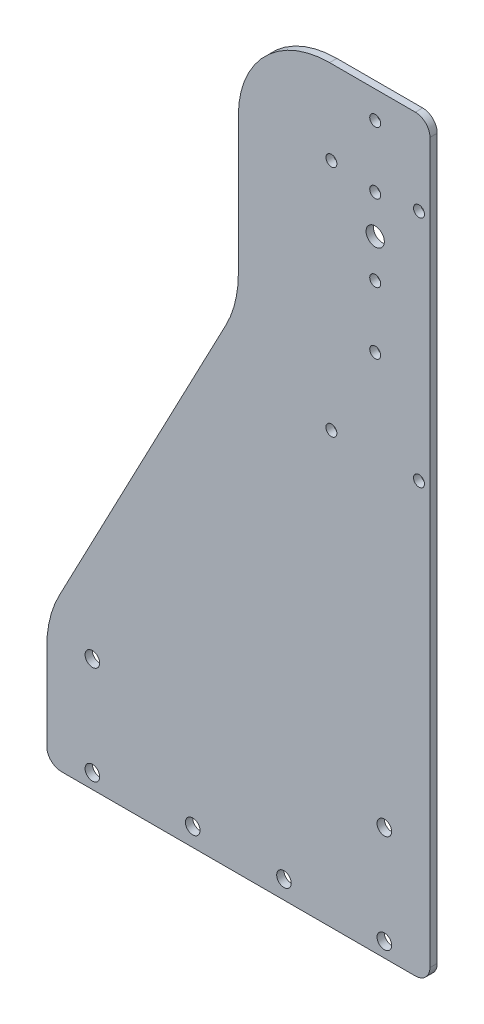
ISO-10303-21;
HEADER;
FILE_DESCRIPTION(('STEP AP214'),'2;1');
FILE_NAME('part.step','',(''),(''),'','','');
FILE_SCHEMA(('AUTOMOTIVE_DESIGN { 1 0 10303 214 1 1 1 1 }'));
ENDSEC;
DATA;
#1=APPLICATION_CONTEXT('core data for automotive mechanical design processes');
#2=APPLICATION_PROTOCOL_DEFINITION('international standard','automotive_design',2000,#1);
#3=PRODUCT_CONTEXT('',#1,'mechanical');
#4=PRODUCT('Part','Part','',(#3));
#5=PRODUCT_RELATED_PRODUCT_CATEGORY('part','',(#4));
#6=PRODUCT_DEFINITION_FORMATION('','',#4);
#7=PRODUCT_DEFINITION_CONTEXT('part definition',#1,'design');
#8=PRODUCT_DEFINITION('design','',#6,#7);
#9=PRODUCT_DEFINITION_SHAPE('','',#8);
#10=(LENGTH_UNIT() NAMED_UNIT(*) SI_UNIT(.MILLI.,.METRE.));
#11=(NAMED_UNIT(*) PLANE_ANGLE_UNIT() SI_UNIT($,.RADIAN.));
#12=(NAMED_UNIT(*) SI_UNIT($,.STERADIAN.) SOLID_ANGLE_UNIT());
#13=UNCERTAINTY_MEASURE_WITH_UNIT(LENGTH_MEASURE(1.E-05),#10,'distance_accuracy_value','');
#14=(GEOMETRIC_REPRESENTATION_CONTEXT(3) GLOBAL_UNCERTAINTY_ASSIGNED_CONTEXT((#13)) GLOBAL_UNIT_ASSIGNED_CONTEXT((#10,
#11,#12)) REPRESENTATION_CONTEXT('',''));
#15=CARTESIAN_POINT('',(0.,0.,0.));
#16=DIRECTION('',(0.,0.,1.));
#17=DIRECTION('',(1.,0.,0.));
#18=AXIS2_PLACEMENT_3D('',#15,#16,#17);
#19=CARTESIAN_POINT('',(45.,284.792651406589,4.));
#20=DIRECTION('',(0.,0.,1.));
#21=DIRECTION('',(1.,0.,0.));
#22=AXIS2_PLACEMENT_3D('',#19,#20,#21);
#23=PLANE('',#22);
#24=CARTESIAN_POINT('',(155.,360.,4.));
#25=DIRECTION('',(0.,0.,-1.));
#26=DIRECTION('',(-1.,0.,0.));
#27=AXIS2_PLACEMENT_3D('',#24,#25,#26);
#28=CIRCLE('',#27,50.);
#29=CARTESIAN_POINT('',(105.,360.,4.));
#30=VERTEX_POINT('',#29);
#31=CARTESIAN_POINT('',(155.,410.,4.));
#32=VERTEX_POINT('',#31);
#33=EDGE_CURVE('E138',#30,#32,#28,.T.);
#34=ORIENTED_EDGE('',*,*,#33,.F.);
#35=DIRECTION('',(0.,1.,0.));
#36=VECTOR('',#35,1.);
#37=CARTESIAN_POINT('',(105.,284.792651406589,4.));
#38=LINE('',#37,#36);
#39=CARTESIAN_POINT('',(105.,284.792651406589,4.));
#40=VERTEX_POINT('',#39);
#41=EDGE_CURVE('E132',#30,#40,#38,.F.);
#42=ORIENTED_EDGE('',*,*,#41,.T.);
#43=CARTESIAN_POINT('',(45.,284.792651406589,4.));
#44=DIRECTION('',(0.,0.,-1.));
#45=DIRECTION('',(-1.,0.,0.));
#46=AXIS2_PLACEMENT_3D('',#43,#44,#45);
#47=CIRCLE('',#46,60.);
#48=CARTESIAN_POINT('',(98.1238741702765,256.902617467193,4.));
#49=VERTEX_POINT('',#48);
#50=EDGE_CURVE('E118',#40,#49,#47,.T.);
#51=ORIENTED_EDGE('',*,*,#50,.T.);
#52=DIRECTION('',(0.46483389898992,0.885397902837944,0.));
#53=VECTOR('',#52,1.);
#54=CARTESIAN_POINT('',(6.87612582972349,83.0973825328067,4.));
#55=LINE('',#54,#53);
#56=CARTESIAN_POINT('',(6.87612582972343,83.0973825328066,4.));
#57=VERTEX_POINT('',#56);
#58=EDGE_CURVE('E114',#49,#57,#55,.F.);
#59=ORIENTED_EDGE('',*,*,#58,.T.);
#60=CARTESIAN_POINT('',(60.,55.2073485934112,4.));
#61=DIRECTION('',(0.,0.,-1.));
#62=DIRECTION('',(-1.,0.,0.));
#63=AXIS2_PLACEMENT_3D('',#60,#61,#62);
#64=CIRCLE('',#63,60.);
#65=CARTESIAN_POINT('',(0.,55.2073485934111,4.));
#66=VERTEX_POINT('',#65);
#67=EDGE_CURVE('E104',#66,#57,#64,.T.);
#68=ORIENTED_EDGE('',*,*,#67,.F.);
#69=DIRECTION('',(0.,1.,0.));
#70=VECTOR('',#69,1.);
#71=CARTESIAN_POINT('',(0.,8.00000000000006,4.));
#72=LINE('',#71,#70);
#73=CARTESIAN_POINT('',(0.,8.,4.));
#74=VERTEX_POINT('',#73);
#75=EDGE_CURVE('E128',#66,#74,#72,.F.);
#76=ORIENTED_EDGE('',*,*,#75,.T.);
#77=CARTESIAN_POINT('',(8.,8.,4.));
#78=DIRECTION('',(0.,0.,-1.));
#79=DIRECTION('',(-1.,0.,0.));
#80=AXIS2_PLACEMENT_3D('',#77,#78,#79);
#81=CIRCLE('',#80,8.);
#82=CARTESIAN_POINT('',(8.00000000000003,0.,4.));
#83=VERTEX_POINT('',#82);
#84=EDGE_CURVE('E150',#83,#74,#81,.T.);
#85=ORIENTED_EDGE('',*,*,#84,.F.);
#86=DIRECTION('',(1.,0.,0.));
#87=VECTOR('',#86,1.);
#88=CARTESIAN_POINT('',(8.00000000000006,0.,4.));
#89=LINE('',#88,#87);
#90=CARTESIAN_POINT('',(202.,0.,4.));
#91=VERTEX_POINT('',#90);
#92=EDGE_CURVE('E145',#83,#91,#89,.T.);
#93=ORIENTED_EDGE('',*,*,#92,.T.);
#94=CARTESIAN_POINT('',(202.,8.,4.));
#95=DIRECTION('',(0.,0.,-1.));
#96=DIRECTION('',(-1.,0.,0.));
#97=AXIS2_PLACEMENT_3D('',#94,#95,#96);
#98=CIRCLE('',#97,8.00000000000001);
#99=CARTESIAN_POINT('',(210.,8.00000000000003,4.));
#100=VERTEX_POINT('',#99);
#101=EDGE_CURVE('E148',#100,#91,#98,.T.);
#102=ORIENTED_EDGE('',*,*,#101,.F.);
#103=DIRECTION('',(0.,1.,0.));
#104=VECTOR('',#103,1.);
#105=CARTESIAN_POINT('',(210.,8.00000000000006,4.));
#106=LINE('',#105,#104);
#107=CARTESIAN_POINT('',(210.,402.,4.));
#108=VERTEX_POINT('',#107);
#109=EDGE_CURVE('E140',#100,#108,#106,.T.);
#110=ORIENTED_EDGE('',*,*,#109,.T.);
#111=CARTESIAN_POINT('',(202.,402.,4.));
#112=DIRECTION('',(0.,0.,-1.));
#113=DIRECTION('',(-1.,0.,0.));
#114=AXIS2_PLACEMENT_3D('',#111,#112,#113);
#115=CIRCLE('',#114,8.00000000000001);
#116=CARTESIAN_POINT('',(202.,410.,4.));
#117=VERTEX_POINT('',#116);
#118=EDGE_CURVE('E143',#117,#108,#115,.T.);
#119=ORIENTED_EDGE('',*,*,#118,.F.);
#120=DIRECTION('',(1.,0.,0.));
#121=VECTOR('',#120,1.);
#122=CARTESIAN_POINT('',(155.,410.,4.));
#123=LINE('',#122,#121);
#124=EDGE_CURVE('E135',#117,#32,#123,.F.);
#125=ORIENTED_EDGE('',*,*,#124,.T.);
#126=EDGE_LOOP('',(#34,#42,#51,#59,#68,#76,#85,#93,#102,#110,#119,#125));
#127=FACE_BOUND('',#126,.T.);
#128=CARTESIAN_POINT('',(24.9999999999999,62.,4.));
#129=DIRECTION('',(0.,0.,1.));
#130=DIRECTION('',(1.,0.,0.));
#131=AXIS2_PLACEMENT_3D('',#128,#129,#130);
#132=CIRCLE('',#131,4.00000000000012);
#133=CARTESIAN_POINT('',(29.,62.,4.));
#134=VERTEX_POINT('',#133);
#135=EDGE_CURVE('E122',#134,#134,#132,.F.);
#136=ORIENTED_EDGE('',*,*,#135,.T.);
#137=EDGE_LOOP('',(#136));
#138=FACE_BOUND('',#137,.T.);
#139=CARTESIAN_POINT('',(185.,62.,4.));
#140=DIRECTION('',(0.,0.,1.));
#141=DIRECTION('',(1.,0.,0.));
#142=AXIS2_PLACEMENT_3D('',#139,#140,#141);
#143=CIRCLE('',#142,4.00000000000009);
#144=CARTESIAN_POINT('',(189.,62.,4.));
#145=VERTEX_POINT('',#144);
#146=EDGE_CURVE('E227',#145,#145,#143,.F.);
#147=ORIENTED_EDGE('',*,*,#146,.T.);
#148=EDGE_LOOP('',(#147));
#149=FACE_BOUND('',#148,.T.);
#150=CARTESIAN_POINT('',(25.,8.,4.));
#151=DIRECTION('',(0.,0.,1.));
#152=DIRECTION('',(1.,0.,0.));
#153=AXIS2_PLACEMENT_3D('',#150,#151,#152);
#154=CIRCLE('',#153,4.00000000000001);
#155=CARTESIAN_POINT('',(29.,8.,4.));
#156=VERTEX_POINT('',#155);
#157=EDGE_CURVE('E230',#156,#156,#154,.F.);
#158=ORIENTED_EDGE('',*,*,#157,.T.);
#159=EDGE_LOOP('',(#158));
#160=FACE_BOUND('',#159,.T.);
#161=CARTESIAN_POINT('',(185.,8.00000000000001,4.));
#162=DIRECTION('',(0.,0.,1.));
#163=DIRECTION('',(1.,0.,0.));
#164=AXIS2_PLACEMENT_3D('',#161,#162,#163);
#165=CIRCLE('',#164,4.);
#166=CARTESIAN_POINT('',(189.,8.00000000000001,4.));
#167=VERTEX_POINT('',#166);
#168=EDGE_CURVE('E233',#167,#167,#165,.F.);
#169=ORIENTED_EDGE('',*,*,#168,.T.);
#170=EDGE_LOOP('',(#169));
#171=FACE_BOUND('',#170,.T.);
#172=CARTESIAN_POINT('',(80.,10.,4.));
#173=DIRECTION('',(0.,0.,1.));
#174=DIRECTION('',(1.,0.,0.));
#175=AXIS2_PLACEMENT_3D('',#172,#173,#174);
#176=CIRCLE('',#175,4.);
#177=CARTESIAN_POINT('',(84.,10.,4.));
#178=VERTEX_POINT('',#177);
#179=EDGE_CURVE('E236',#178,#178,#176,.F.);
#180=ORIENTED_EDGE('',*,*,#179,.T.);
#181=EDGE_LOOP('',(#180));
#182=FACE_BOUND('',#181,.T.);
#183=CARTESIAN_POINT('',(130.,10.,4.));
#184=DIRECTION('',(0.,0.,1.));
#185=DIRECTION('',(1.,0.,0.));
#186=AXIS2_PLACEMENT_3D('',#183,#184,#185);
#187=CIRCLE('',#186,4.);
#188=CARTESIAN_POINT('',(134.,10.,4.));
#189=VERTEX_POINT('',#188);
#190=EDGE_CURVE('E239',#189,#189,#187,.F.);
#191=ORIENTED_EDGE('',*,*,#190,.T.);
#192=EDGE_LOOP('',(#191));
#193=FACE_BOUND('',#192,.T.);
#194=CARTESIAN_POINT('',(180.,340.,4.));
#195=DIRECTION('',(0.,0.,1.));
#196=DIRECTION('',(1.,0.,0.));
#197=AXIS2_PLACEMENT_3D('',#194,#195,#196);
#198=CIRCLE('',#197,5.);
#199=CARTESIAN_POINT('',(185.,340.,4.));
#200=VERTEX_POINT('',#199);
#201=EDGE_CURVE('E242',#200,#200,#198,.F.);
#202=ORIENTED_EDGE('',*,*,#201,.T.);
#203=EDGE_LOOP('',(#202));
#204=FACE_BOUND('',#203,.T.);
#205=CARTESIAN_POINT('',(180.,395.,4.));
#206=DIRECTION('',(0.,0.,1.));
#207=DIRECTION('',(1.,0.,0.));
#208=AXIS2_PLACEMENT_3D('',#205,#206,#207);
#209=CIRCLE('',#208,3.);
#210=CARTESIAN_POINT('',(183.,395.,4.));
#211=VERTEX_POINT('',#210);
#212=EDGE_CURVE('E245',#211,#211,#209,.F.);
#213=ORIENTED_EDGE('',*,*,#212,.T.);
#214=EDGE_LOOP('',(#213));
#215=FACE_BOUND('',#214,.T.);
#216=CARTESIAN_POINT('',(180.,361.,4.));
#217=DIRECTION('',(0.,0.,1.));
#218=DIRECTION('',(1.,0.,0.));
#219=AXIS2_PLACEMENT_3D('',#216,#217,#218);
#220=CIRCLE('',#219,3.);
#221=CARTESIAN_POINT('',(183.,361.,4.));
#222=VERTEX_POINT('',#221);
#223=EDGE_CURVE('E248',#222,#222,#220,.F.);
#224=ORIENTED_EDGE('',*,*,#223,.T.);
#225=EDGE_LOOP('',(#224));
#226=FACE_BOUND('',#225,.T.);
#227=CARTESIAN_POINT('',(156.,364.,4.));
#228=DIRECTION('',(0.,0.,1.));
#229=DIRECTION('',(1.,0.,0.));
#230=AXIS2_PLACEMENT_3D('',#227,#228,#229);
#231=CIRCLE('',#230,3.);
#232=CARTESIAN_POINT('',(159.,364.,4.));
#233=VERTEX_POINT('',#232);
#234=EDGE_CURVE('E251',#233,#233,#231,.F.);
#235=ORIENTED_EDGE('',*,*,#234,.T.);
#236=EDGE_LOOP('',(#235));
#237=FACE_BOUND('',#236,.T.);
#238=CARTESIAN_POINT('',(180.,319.,4.));
#239=DIRECTION('',(0.,0.,1.));
#240=DIRECTION('',(1.,0.,0.));
#241=AXIS2_PLACEMENT_3D('',#238,#239,#240);
#242=CIRCLE('',#241,3.);
#243=CARTESIAN_POINT('',(183.,319.,4.));
#244=VERTEX_POINT('',#243);
#245=EDGE_CURVE('E254',#244,#244,#242,.F.);
#246=ORIENTED_EDGE('',*,*,#245,.T.);
#247=EDGE_LOOP('',(#246));
#248=FACE_BOUND('',#247,.T.);
#249=CARTESIAN_POINT('',(180.,285.,4.));
#250=DIRECTION('',(0.,0.,1.));
#251=DIRECTION('',(1.,0.,0.));
#252=AXIS2_PLACEMENT_3D('',#249,#250,#251);
#253=CIRCLE('',#252,3.);
#254=CARTESIAN_POINT('',(183.,285.,4.));
#255=VERTEX_POINT('',#254);
#256=EDGE_CURVE('E257',#255,#255,#253,.F.);
#257=ORIENTED_EDGE('',*,*,#256,.T.);
#258=EDGE_LOOP('',(#257));
#259=FACE_BOUND('',#258,.T.);
#260=CARTESIAN_POINT('',(156.,236.,4.));
#261=DIRECTION('',(0.,0.,1.));
#262=DIRECTION('',(1.,0.,0.));
#263=AXIS2_PLACEMENT_3D('',#260,#261,#262);
#264=CIRCLE('',#263,3.);
#265=CARTESIAN_POINT('',(159.,236.,4.));
#266=VERTEX_POINT('',#265);
#267=EDGE_CURVE('E260',#266,#266,#264,.F.);
#268=ORIENTED_EDGE('',*,*,#267,.T.);
#269=EDGE_LOOP('',(#268));
#270=FACE_BOUND('',#269,.T.);
#271=CARTESIAN_POINT('',(204.,236.,4.));
#272=DIRECTION('',(0.,0.,1.));
#273=DIRECTION('',(1.,0.,0.));
#274=AXIS2_PLACEMENT_3D('',#271,#272,#273);
#275=CIRCLE('',#274,3.);
#276=CARTESIAN_POINT('',(207.,236.,4.));
#277=VERTEX_POINT('',#276);
#278=EDGE_CURVE('E262',#277,#277,#275,.F.);
#279=ORIENTED_EDGE('',*,*,#278,.T.);
#280=EDGE_LOOP('',(#279));
#281=FACE_BOUND('',#280,.T.);
#282=CARTESIAN_POINT('',(204.,364.,4.));
#283=DIRECTION('',(0.,0.,1.));
#284=DIRECTION('',(1.,0.,0.));
#285=AXIS2_PLACEMENT_3D('',#282,#283,#284);
#286=CIRCLE('',#285,3.);
#287=CARTESIAN_POINT('',(207.,364.,4.));
#288=VERTEX_POINT('',#287);
#289=EDGE_CURVE('E20',#288,#288,#286,.F.);
#290=ORIENTED_EDGE('',*,*,#289,.T.);
#291=EDGE_LOOP('',(#290));
#292=FACE_BOUND('',#291,.T.);
#293=ADVANCED_FACE('F17',(#127,#138,#149,#160,#171,#182,#193,#204,#215,#226,#237,#248,#259,#270,
#281,#292),#23,.T.);
#294=CARTESIAN_POINT('',(204.,364.,0.));
#295=DIRECTION('',(0.,0.,1.));
#296=DIRECTION('',(1.,0.,0.));
#297=AXIS2_PLACEMENT_3D('',#294,#295,#296);
#298=CYLINDRICAL_SURFACE('',#297,3.);
#299=CARTESIAN_POINT('',(204.,364.,0.));
#300=DIRECTION('',(0.,0.,1.));
#301=DIRECTION('',(1.,0.,0.));
#302=AXIS2_PLACEMENT_3D('',#299,#300,#301);
#303=CIRCLE('',#302,3.);
#304=CARTESIAN_POINT('',(207.,364.,0.));
#305=VERTEX_POINT('',#304);
#306=EDGE_CURVE('E212',#305,#305,#303,.F.);
#307=ORIENTED_EDGE('',*,*,#306,.T.);
#308=EDGE_LOOP('',(#307));
#309=FACE_BOUND('',#308,.T.);
#310=ORIENTED_EDGE('',*,*,#289,.F.);
#311=EDGE_LOOP('',(#310));
#312=FACE_BOUND('',#311,.T.);
#313=ADVANCED_FACE('F270',(#309,#312),#298,.F.);
#314=CARTESIAN_POINT('',(204.,236.,0.));
#315=DIRECTION('',(0.,0.,1.));
#316=DIRECTION('',(1.,0.,0.));
#317=AXIS2_PLACEMENT_3D('',#314,#315,#316);
#318=CYLINDRICAL_SURFACE('',#317,3.);
#319=CARTESIAN_POINT('',(204.,236.,0.));
#320=DIRECTION('',(0.,0.,1.));
#321=DIRECTION('',(1.,0.,0.));
#322=AXIS2_PLACEMENT_3D('',#319,#320,#321);
#323=CIRCLE('',#322,3.);
#324=CARTESIAN_POINT('',(207.,236.,0.));
#325=VERTEX_POINT('',#324);
#326=EDGE_CURVE('E209',#325,#325,#323,.F.);
#327=ORIENTED_EDGE('',*,*,#326,.T.);
#328=EDGE_LOOP('',(#327));
#329=FACE_BOUND('',#328,.T.);
#330=ORIENTED_EDGE('',*,*,#278,.F.);
#331=EDGE_LOOP('',(#330));
#332=FACE_BOUND('',#331,.T.);
#333=ADVANCED_FACE('F272',(#329,#332),#318,.F.);
#334=CARTESIAN_POINT('',(156.,236.,0.));
#335=DIRECTION('',(0.,0.,1.));
#336=DIRECTION('',(1.,0.,0.));
#337=AXIS2_PLACEMENT_3D('',#334,#335,#336);
#338=CYLINDRICAL_SURFACE('',#337,3.);
#339=CARTESIAN_POINT('',(156.,236.,0.));
#340=DIRECTION('',(0.,0.,1.));
#341=DIRECTION('',(1.,0.,0.));
#342=AXIS2_PLACEMENT_3D('',#339,#340,#341);
#343=CIRCLE('',#342,3.);
#344=CARTESIAN_POINT('',(159.,236.,0.));
#345=VERTEX_POINT('',#344);
#346=EDGE_CURVE('E206',#345,#345,#343,.F.);
#347=ORIENTED_EDGE('',*,*,#346,.T.);
#348=EDGE_LOOP('',(#347));
#349=FACE_BOUND('',#348,.T.);
#350=ORIENTED_EDGE('',*,*,#267,.F.);
#351=EDGE_LOOP('',(#350));
#352=FACE_BOUND('',#351,.T.);
#353=ADVANCED_FACE('F279',(#349,#352),#338,.F.);
#354=CARTESIAN_POINT('',(180.,285.,0.));
#355=DIRECTION('',(0.,0.,1.));
#356=DIRECTION('',(1.,0.,0.));
#357=AXIS2_PLACEMENT_3D('',#354,#355,#356);
#358=CYLINDRICAL_SURFACE('',#357,3.);
#359=CARTESIAN_POINT('',(180.,285.,0.));
#360=DIRECTION('',(0.,0.,1.));
#361=DIRECTION('',(1.,0.,0.));
#362=AXIS2_PLACEMENT_3D('',#359,#360,#361);
#363=CIRCLE('',#362,3.);
#364=CARTESIAN_POINT('',(183.,285.,0.));
#365=VERTEX_POINT('',#364);
#366=EDGE_CURVE('E203',#365,#365,#363,.F.);
#367=ORIENTED_EDGE('',*,*,#366,.T.);
#368=EDGE_LOOP('',(#367));
#369=FACE_BOUND('',#368,.T.);
#370=ORIENTED_EDGE('',*,*,#256,.F.);
#371=EDGE_LOOP('',(#370));
#372=FACE_BOUND('',#371,.T.);
#373=ADVANCED_FACE('F377',(#369,#372),#358,.F.);
#374=CARTESIAN_POINT('',(180.,319.,0.));
#375=DIRECTION('',(0.,0.,1.));
#376=DIRECTION('',(1.,0.,0.));
#377=AXIS2_PLACEMENT_3D('',#374,#375,#376);
#378=CYLINDRICAL_SURFACE('',#377,3.);
#379=CARTESIAN_POINT('',(180.,319.,0.));
#380=DIRECTION('',(0.,0.,1.));
#381=DIRECTION('',(1.,0.,0.));
#382=AXIS2_PLACEMENT_3D('',#379,#380,#381);
#383=CIRCLE('',#382,3.);
#384=CARTESIAN_POINT('',(183.,319.,0.));
#385=VERTEX_POINT('',#384);
#386=EDGE_CURVE('E200',#385,#385,#383,.F.);
#387=ORIENTED_EDGE('',*,*,#386,.T.);
#388=EDGE_LOOP('',(#387));
#389=FACE_BOUND('',#388,.T.);
#390=ORIENTED_EDGE('',*,*,#245,.F.);
#391=EDGE_LOOP('',(#390));
#392=FACE_BOUND('',#391,.T.);
#393=ADVANCED_FACE('F373',(#389,#392),#378,.F.);
#394=CARTESIAN_POINT('',(156.,364.,0.));
#395=DIRECTION('',(0.,0.,1.));
#396=DIRECTION('',(1.,0.,0.));
#397=AXIS2_PLACEMENT_3D('',#394,#395,#396);
#398=CYLINDRICAL_SURFACE('',#397,3.);
#399=CARTESIAN_POINT('',(156.,364.,0.));
#400=DIRECTION('',(0.,0.,1.));
#401=DIRECTION('',(1.,0.,0.));
#402=AXIS2_PLACEMENT_3D('',#399,#400,#401);
#403=CIRCLE('',#402,3.);
#404=CARTESIAN_POINT('',(159.,364.,0.));
#405=VERTEX_POINT('',#404);
#406=EDGE_CURVE('E197',#405,#405,#403,.F.);
#407=ORIENTED_EDGE('',*,*,#406,.T.);
#408=EDGE_LOOP('',(#407));
#409=FACE_BOUND('',#408,.T.);
#410=ORIENTED_EDGE('',*,*,#234,.F.);
#411=EDGE_LOOP('',(#410));
#412=FACE_BOUND('',#411,.T.);
#413=ADVANCED_FACE('F369',(#409,#412),#398,.F.);
#414=CARTESIAN_POINT('',(180.,361.,0.));
#415=DIRECTION('',(0.,0.,1.));
#416=DIRECTION('',(1.,0.,0.));
#417=AXIS2_PLACEMENT_3D('',#414,#415,#416);
#418=CYLINDRICAL_SURFACE('',#417,3.);
#419=CARTESIAN_POINT('',(180.,361.,0.));
#420=DIRECTION('',(0.,0.,1.));
#421=DIRECTION('',(1.,0.,0.));
#422=AXIS2_PLACEMENT_3D('',#419,#420,#421);
#423=CIRCLE('',#422,3.);
#424=CARTESIAN_POINT('',(183.,361.,0.));
#425=VERTEX_POINT('',#424);
#426=EDGE_CURVE('E194',#425,#425,#423,.F.);
#427=ORIENTED_EDGE('',*,*,#426,.T.);
#428=EDGE_LOOP('',(#427));
#429=FACE_BOUND('',#428,.T.);
#430=ORIENTED_EDGE('',*,*,#223,.F.);
#431=EDGE_LOOP('',(#430));
#432=FACE_BOUND('',#431,.T.);
#433=ADVANCED_FACE('F365',(#429,#432),#418,.F.);
#434=CARTESIAN_POINT('',(180.,395.,0.));
#435=DIRECTION('',(0.,0.,1.));
#436=DIRECTION('',(1.,0.,0.));
#437=AXIS2_PLACEMENT_3D('',#434,#435,#436);
#438=CYLINDRICAL_SURFACE('',#437,3.);
#439=CARTESIAN_POINT('',(180.,395.,0.));
#440=DIRECTION('',(0.,0.,1.));
#441=DIRECTION('',(1.,0.,0.));
#442=AXIS2_PLACEMENT_3D('',#439,#440,#441);
#443=CIRCLE('',#442,3.);
#444=CARTESIAN_POINT('',(183.,395.,0.));
#445=VERTEX_POINT('',#444);
#446=EDGE_CURVE('E191',#445,#445,#443,.F.);
#447=ORIENTED_EDGE('',*,*,#446,.T.);
#448=EDGE_LOOP('',(#447));
#449=FACE_BOUND('',#448,.T.);
#450=ORIENTED_EDGE('',*,*,#212,.F.);
#451=EDGE_LOOP('',(#450));
#452=FACE_BOUND('',#451,.T.);
#453=ADVANCED_FACE('F361',(#449,#452),#438,.F.);
#454=CARTESIAN_POINT('',(180.,340.,0.));
#455=DIRECTION('',(0.,0.,1.));
#456=DIRECTION('',(1.,0.,0.));
#457=AXIS2_PLACEMENT_3D('',#454,#455,#456);
#458=CYLINDRICAL_SURFACE('',#457,5.);
#459=CARTESIAN_POINT('',(180.,340.,0.));
#460=DIRECTION('',(0.,0.,1.));
#461=DIRECTION('',(1.,0.,0.));
#462=AXIS2_PLACEMENT_3D('',#459,#460,#461);
#463=CIRCLE('',#462,5.);
#464=CARTESIAN_POINT('',(185.,340.,0.));
#465=VERTEX_POINT('',#464);
#466=EDGE_CURVE('E188',#465,#465,#463,.F.);
#467=ORIENTED_EDGE('',*,*,#466,.T.);
#468=EDGE_LOOP('',(#467));
#469=FACE_BOUND('',#468,.T.);
#470=ORIENTED_EDGE('',*,*,#201,.F.);
#471=EDGE_LOOP('',(#470));
#472=FACE_BOUND('',#471,.T.);
#473=ADVANCED_FACE('F357',(#469,#472),#458,.F.);
#474=CARTESIAN_POINT('',(130.,10.,0.));
#475=DIRECTION('',(0.,0.,1.));
#476=DIRECTION('',(1.,0.,0.));
#477=AXIS2_PLACEMENT_3D('',#474,#475,#476);
#478=CYLINDRICAL_SURFACE('',#477,4.);
#479=CARTESIAN_POINT('',(130.,10.,0.));
#480=DIRECTION('',(0.,0.,1.));
#481=DIRECTION('',(1.,0.,0.));
#482=AXIS2_PLACEMENT_3D('',#479,#480,#481);
#483=CIRCLE('',#482,4.);
#484=CARTESIAN_POINT('',(134.,10.,0.));
#485=VERTEX_POINT('',#484);
#486=EDGE_CURVE('E185',#485,#485,#483,.F.);
#487=ORIENTED_EDGE('',*,*,#486,.T.);
#488=EDGE_LOOP('',(#487));
#489=FACE_BOUND('',#488,.T.);
#490=ORIENTED_EDGE('',*,*,#190,.F.);
#491=EDGE_LOOP('',(#490));
#492=FACE_BOUND('',#491,.T.);
#493=ADVANCED_FACE('F353',(#489,#492),#478,.F.);
#494=CARTESIAN_POINT('',(80.,10.,0.));
#495=DIRECTION('',(0.,0.,1.));
#496=DIRECTION('',(1.,0.,0.));
#497=AXIS2_PLACEMENT_3D('',#494,#495,#496);
#498=CYLINDRICAL_SURFACE('',#497,4.);
#499=CARTESIAN_POINT('',(80.,10.,0.));
#500=DIRECTION('',(0.,0.,1.));
#501=DIRECTION('',(1.,0.,0.));
#502=AXIS2_PLACEMENT_3D('',#499,#500,#501);
#503=CIRCLE('',#502,4.);
#504=CARTESIAN_POINT('',(84.,10.,0.));
#505=VERTEX_POINT('',#504);
#506=EDGE_CURVE('E182',#505,#505,#503,.F.);
#507=ORIENTED_EDGE('',*,*,#506,.T.);
#508=EDGE_LOOP('',(#507));
#509=FACE_BOUND('',#508,.T.);
#510=ORIENTED_EDGE('',*,*,#179,.F.);
#511=EDGE_LOOP('',(#510));
#512=FACE_BOUND('',#511,.T.);
#513=ADVANCED_FACE('F349',(#509,#512),#498,.F.);
#514=CARTESIAN_POINT('',(185.,8.00000000000001,0.));
#515=DIRECTION('',(0.,0.,1.));
#516=DIRECTION('',(1.,0.,0.));
#517=AXIS2_PLACEMENT_3D('',#514,#515,#516);
#518=CYLINDRICAL_SURFACE('',#517,4.);
#519=CARTESIAN_POINT('',(185.,8.00000000000001,0.));
#520=DIRECTION('',(0.,0.,1.));
#521=DIRECTION('',(1.,0.,0.));
#522=AXIS2_PLACEMENT_3D('',#519,#520,#521);
#523=CIRCLE('',#522,4.);
#524=CARTESIAN_POINT('',(189.,8.00000000000001,0.));
#525=VERTEX_POINT('',#524);
#526=EDGE_CURVE('E179',#525,#525,#523,.F.);
#527=ORIENTED_EDGE('',*,*,#526,.T.);
#528=EDGE_LOOP('',(#527));
#529=FACE_BOUND('',#528,.T.);
#530=ORIENTED_EDGE('',*,*,#168,.F.);
#531=EDGE_LOOP('',(#530));
#532=FACE_BOUND('',#531,.T.);
#533=ADVANCED_FACE('F345',(#529,#532),#518,.F.);
#534=CARTESIAN_POINT('',(25.,8.,0.));
#535=DIRECTION('',(0.,0.,1.));
#536=DIRECTION('',(1.,0.,0.));
#537=AXIS2_PLACEMENT_3D('',#534,#535,#536);
#538=CYLINDRICAL_SURFACE('',#537,4.00000000000001);
#539=CARTESIAN_POINT('',(25.,8.,0.));
#540=DIRECTION('',(0.,0.,1.));
#541=DIRECTION('',(1.,0.,0.));
#542=AXIS2_PLACEMENT_3D('',#539,#540,#541);
#543=CIRCLE('',#542,4.00000000000001);
#544=CARTESIAN_POINT('',(29.,8.,0.));
#545=VERTEX_POINT('',#544);
#546=EDGE_CURVE('E176',#545,#545,#543,.F.);
#547=ORIENTED_EDGE('',*,*,#546,.T.);
#548=EDGE_LOOP('',(#547));
#549=FACE_BOUND('',#548,.T.);
#550=ORIENTED_EDGE('',*,*,#157,.F.);
#551=EDGE_LOOP('',(#550));
#552=FACE_BOUND('',#551,.T.);
#553=ADVANCED_FACE('F341',(#549,#552),#538,.F.);
#554=CARTESIAN_POINT('',(185.,62.,0.));
#555=DIRECTION('',(0.,0.,1.));
#556=DIRECTION('',(1.,0.,0.));
#557=AXIS2_PLACEMENT_3D('',#554,#555,#556);
#558=CYLINDRICAL_SURFACE('',#557,4.00000000000009);
#559=CARTESIAN_POINT('',(185.,62.,0.));
#560=DIRECTION('',(0.,0.,1.));
#561=DIRECTION('',(1.,0.,0.));
#562=AXIS2_PLACEMENT_3D('',#559,#560,#561);
#563=CIRCLE('',#562,4.00000000000009);
#564=CARTESIAN_POINT('',(189.,62.,0.));
#565=VERTEX_POINT('',#564);
#566=EDGE_CURVE('E173',#565,#565,#563,.F.);
#567=ORIENTED_EDGE('',*,*,#566,.T.);
#568=EDGE_LOOP('',(#567));
#569=FACE_BOUND('',#568,.T.);
#570=ORIENTED_EDGE('',*,*,#146,.F.);
#571=EDGE_LOOP('',(#570));
#572=FACE_BOUND('',#571,.T.);
#573=ADVANCED_FACE('F337',(#569,#572),#558,.F.);
#574=CARTESIAN_POINT('',(24.9999999999999,62.,0.));
#575=DIRECTION('',(0.,0.,1.));
#576=DIRECTION('',(1.,0.,0.));
#577=AXIS2_PLACEMENT_3D('',#574,#575,#576);
#578=CYLINDRICAL_SURFACE('',#577,4.00000000000012);
#579=CARTESIAN_POINT('',(24.9999999999999,62.,0.));
#580=DIRECTION('',(0.,0.,1.));
#581=DIRECTION('',(1.,0.,0.));
#582=AXIS2_PLACEMENT_3D('',#579,#580,#581);
#583=CIRCLE('',#582,4.00000000000012);
#584=CARTESIAN_POINT('',(29.,62.,0.));
#585=VERTEX_POINT('',#584);
#586=EDGE_CURVE('E170',#585,#585,#583,.F.);
#587=ORIENTED_EDGE('',*,*,#586,.T.);
#588=EDGE_LOOP('',(#587));
#589=FACE_BOUND('',#588,.T.);
#590=ORIENTED_EDGE('',*,*,#135,.F.);
#591=EDGE_LOOP('',(#590));
#592=FACE_BOUND('',#591,.T.);
#593=ADVANCED_FACE('F334',(#589,#592),#578,.F.);
#594=CARTESIAN_POINT('',(6.87612582972349,83.0973825328067,4.));
#595=DIRECTION('',(0.885397902837944,-0.46483389898992,0.));
#596=DIRECTION('',(0.46483389898992,0.885397902837944,0.));
#597=AXIS2_PLACEMENT_3D('',#594,#595,#596);
#598=PLANE('',#597);
#599=DIRECTION('',(0.,0.,-1.));
#600=VECTOR('',#599,1.);
#601=CARTESIAN_POINT('',(6.8761258297235,83.0973825328067,4.));
#602=LINE('',#601,#600);
#603=CARTESIAN_POINT('',(6.87612582972343,83.0973825328066,0.));
#604=VERTEX_POINT('',#603);
#605=EDGE_CURVE('E111',#57,#604,#602,.T.);
#606=ORIENTED_EDGE('',*,*,#605,.F.);
#607=ORIENTED_EDGE('',*,*,#58,.F.);
#608=DIRECTION('',(0.,0.,-1.));
#609=VECTOR('',#608,1.);
#610=CARTESIAN_POINT('',(98.1238741702765,256.902617467193,4.));
#611=LINE('',#610,#609);
#612=CARTESIAN_POINT('',(98.1238741702766,256.902617467193,0.));
#613=VERTEX_POINT('',#612);
#614=EDGE_CURVE('E215',#49,#613,#611,.T.);
#615=ORIENTED_EDGE('',*,*,#614,.T.);
#616=DIRECTION('',(-0.46483389898992,-0.885397902837944,0.));
#617=VECTOR('',#616,1.);
#618=CARTESIAN_POINT('',(98.1238741702765,256.902617467193,0.));
#619=LINE('',#618,#617);
#620=EDGE_CURVE('E126',#613,#604,#619,.T.);
#621=ORIENTED_EDGE('',*,*,#620,.T.);
#622=EDGE_LOOP('',(#606,#607,#615,#621));
#623=FACE_BOUND('',#622,.T.);
#624=ADVANCED_FACE('F125',(#623),#598,.F.);
#625=CARTESIAN_POINT('',(60.,55.2073485934112,4.));
#626=DIRECTION('',(0.,0.,-1.));
#627=DIRECTION('',(-1.,0.,0.));
#628=AXIS2_PLACEMENT_3D('',#625,#626,#627);
#629=CYLINDRICAL_SURFACE('',#628,60.);
#630=ORIENTED_EDGE('',*,*,#67,.T.);
#631=ORIENTED_EDGE('',*,*,#605,.T.);
#632=CARTESIAN_POINT('',(60.,55.2073485934112,0.));
#633=DIRECTION('',(0.,0.,-1.));
#634=DIRECTION('',(-1.,0.,0.));
#635=AXIS2_PLACEMENT_3D('',#632,#633,#634);
#636=CIRCLE('',#635,60.);
#637=CARTESIAN_POINT('',(0.,55.2073485934111,0.));
#638=VERTEX_POINT('',#637);
#639=EDGE_CURVE('E168',#604,#638,#636,.F.);
#640=ORIENTED_EDGE('',*,*,#639,.T.);
#641=DIRECTION('',(0.,0.,-1.));
#642=VECTOR('',#641,1.);
#643=CARTESIAN_POINT('',(0.,55.207348593411,4.));
#644=LINE('',#643,#642);
#645=EDGE_CURVE('E113',#638,#66,#644,.F.);
#646=ORIENTED_EDGE('',*,*,#645,.T.);
#647=EDGE_LOOP('',(#630,#631,#640,#646));
#648=FACE_BOUND('',#647,.T.);
#649=ADVANCED_FACE('F108',(#648),#629,.T.);
#650=CARTESIAN_POINT('',(0.,8.00000000000006,4.));
#651=DIRECTION('',(1.,0.,0.));
#652=DIRECTION('',(0.,0.,-1.));
#653=AXIS2_PLACEMENT_3D('',#650,#651,#652);
#654=PLANE('',#653);
#655=DIRECTION('',(0.,0.,-1.));
#656=VECTOR('',#655,1.);
#657=CARTESIAN_POINT('',(0.,8.,4.));
#658=LINE('',#657,#656);
#659=CARTESIAN_POINT('',(0.,8.,0.));
#660=VERTEX_POINT('',#659);
#661=EDGE_CURVE('E223',#74,#660,#658,.T.);
#662=ORIENTED_EDGE('',*,*,#661,.F.);
#663=ORIENTED_EDGE('',*,*,#75,.F.);
#664=ORIENTED_EDGE('',*,*,#645,.F.);
#665=DIRECTION('',(0.,1.,0.));
#666=VECTOR('',#665,1.);
#667=CARTESIAN_POINT('',(0.,284.792651406589,0.));
#668=LINE('',#667,#666);
#669=EDGE_CURVE('E167',#638,#660,#668,.F.);
#670=ORIENTED_EDGE('',*,*,#669,.T.);
#671=EDGE_LOOP('',(#662,#663,#664,#670));
#672=FACE_BOUND('',#671,.T.);
#673=ADVANCED_FACE('F325',(#672),#654,.F.);
#674=CARTESIAN_POINT('',(8.,8.,4.));
#675=DIRECTION('',(0.,0.,-1.));
#676=DIRECTION('',(-1.,0.,0.));
#677=AXIS2_PLACEMENT_3D('',#674,#675,#676);
#678=CYLINDRICAL_SURFACE('',#677,8.);
#679=ORIENTED_EDGE('',*,*,#84,.T.);
#680=ORIENTED_EDGE('',*,*,#661,.T.);
#681=CARTESIAN_POINT('',(8.,8.,0.));
#682=DIRECTION('',(0.,0.,-1.));
#683=DIRECTION('',(-1.,0.,0.));
#684=AXIS2_PLACEMENT_3D('',#681,#682,#683);
#685=CIRCLE('',#684,8.);
#686=CARTESIAN_POINT('',(8.00000000000003,0.,0.));
#687=VERTEX_POINT('',#686);
#688=EDGE_CURVE('E164',#660,#687,#685,.F.);
#689=ORIENTED_EDGE('',*,*,#688,.T.);
#690=DIRECTION('',(0.,0.,1.));
#691=VECTOR('',#690,1.);
#692=CARTESIAN_POINT('',(8.00000000000006,0.,4.));
#693=LINE('',#692,#691);
#694=EDGE_CURVE('E149',#687,#83,#693,.T.);
#695=ORIENTED_EDGE('',*,*,#694,.T.);
#696=EDGE_LOOP('',(#679,#680,#689,#695));
#697=FACE_BOUND('',#696,.T.);
#698=ADVANCED_FACE('F321',(#697),#678,.T.);
#699=CARTESIAN_POINT('',(8.00000000000006,0.,4.));
#700=DIRECTION('',(0.,1.,0.));
#701=DIRECTION('',(0.,0.,1.));
#702=AXIS2_PLACEMENT_3D('',#699,#700,#701);
#703=PLANE('',#702);
#704=DIRECTION('',(0.,0.,-1.));
#705=VECTOR('',#704,1.);
#706=CARTESIAN_POINT('',(202.,0.,4.));
#707=LINE('',#706,#705);
#708=CARTESIAN_POINT('',(202.,0.,0.));
#709=VERTEX_POINT('',#708);
#710=EDGE_CURVE('E222',#91,#709,#707,.T.);
#711=ORIENTED_EDGE('',*,*,#710,.F.);
#712=ORIENTED_EDGE('',*,*,#92,.F.);
#713=ORIENTED_EDGE('',*,*,#694,.F.);
#714=DIRECTION('',(1.,0.,0.));
#715=VECTOR('',#714,1.);
#716=CARTESIAN_POINT('',(45.,0.,0.));
#717=LINE('',#716,#715);
#718=EDGE_CURVE('E163',#687,#709,#717,.T.);
#719=ORIENTED_EDGE('',*,*,#718,.T.);
#720=EDGE_LOOP('',(#711,#712,#713,#719));
#721=FACE_BOUND('',#720,.T.);
#722=ADVANCED_FACE('F317',(#721),#703,.F.);
#723=CARTESIAN_POINT('',(202.,8.,4.));
#724=DIRECTION('',(0.,0.,-1.));
#725=DIRECTION('',(-1.,0.,0.));
#726=AXIS2_PLACEMENT_3D('',#723,#724,#725);
#727=CYLINDRICAL_SURFACE('',#726,8.00000000000001);
#728=ORIENTED_EDGE('',*,*,#101,.T.);
#729=ORIENTED_EDGE('',*,*,#710,.T.);
#730=CARTESIAN_POINT('',(202.,8.,0.));
#731=DIRECTION('',(0.,0.,-1.));
#732=DIRECTION('',(-1.,0.,0.));
#733=AXIS2_PLACEMENT_3D('',#730,#731,#732);
#734=CIRCLE('',#733,8.00000000000001);
#735=CARTESIAN_POINT('',(210.,8.00000000000003,0.));
#736=VERTEX_POINT('',#735);
#737=EDGE_CURVE('E160',#709,#736,#734,.F.);
#738=ORIENTED_EDGE('',*,*,#737,.T.);
#739=DIRECTION('',(0.,0.,1.));
#740=VECTOR('',#739,1.);
#741=CARTESIAN_POINT('',(210.,8.00000000000006,4.));
#742=LINE('',#741,#740);
#743=EDGE_CURVE('E144',#736,#100,#742,.T.);
#744=ORIENTED_EDGE('',*,*,#743,.T.);
#745=EDGE_LOOP('',(#728,#729,#738,#744));
#746=FACE_BOUND('',#745,.T.);
#747=ADVANCED_FACE('F313',(#746),#727,.T.);
#748=CARTESIAN_POINT('',(210.,8.00000000000006,4.));
#749=DIRECTION('',(-1.,0.,0.));
#750=DIRECTION('',(0.,0.,1.));
#751=AXIS2_PLACEMENT_3D('',#748,#749,#750);
#752=PLANE('',#751);
#753=DIRECTION('',(0.,0.,-1.));
#754=VECTOR('',#753,1.);
#755=CARTESIAN_POINT('',(210.,402.,4.));
#756=LINE('',#755,#754);
#757=CARTESIAN_POINT('',(210.,402.,0.));
#758=VERTEX_POINT('',#757);
#759=EDGE_CURVE('E220',#108,#758,#756,.T.);
#760=ORIENTED_EDGE('',*,*,#759,.F.);
#761=ORIENTED_EDGE('',*,*,#109,.F.);
#762=ORIENTED_EDGE('',*,*,#743,.F.);
#763=DIRECTION('',(0.,1.,0.));
#764=VECTOR('',#763,1.);
#765=CARTESIAN_POINT('',(210.,284.792651406589,0.));
#766=LINE('',#765,#764);
#767=EDGE_CURVE('E159',#736,#758,#766,.T.);
#768=ORIENTED_EDGE('',*,*,#767,.T.);
#769=EDGE_LOOP('',(#760,#761,#762,#768));
#770=FACE_BOUND('',#769,.T.);
#771=ADVANCED_FACE('F309',(#770),#752,.F.);
#772=CARTESIAN_POINT('',(202.,402.,4.));
#773=DIRECTION('',(0.,0.,-1.));
#774=DIRECTION('',(-1.,0.,0.));
#775=AXIS2_PLACEMENT_3D('',#772,#773,#774);
#776=CYLINDRICAL_SURFACE('',#775,8.00000000000001);
#777=ORIENTED_EDGE('',*,*,#118,.T.);
#778=ORIENTED_EDGE('',*,*,#759,.T.);
#779=CARTESIAN_POINT('',(202.,402.,0.));
#780=DIRECTION('',(0.,0.,-1.));
#781=DIRECTION('',(-1.,0.,0.));
#782=AXIS2_PLACEMENT_3D('',#779,#780,#781);
#783=CIRCLE('',#782,8.00000000000001);
#784=CARTESIAN_POINT('',(202.,410.,0.));
#785=VERTEX_POINT('',#784);
#786=EDGE_CURVE('E156',#758,#785,#783,.F.);
#787=ORIENTED_EDGE('',*,*,#786,.T.);
#788=DIRECTION('',(0.,0.,-1.));
#789=VECTOR('',#788,1.);
#790=CARTESIAN_POINT('',(202.,410.,4.));
#791=LINE('',#790,#789);
#792=EDGE_CURVE('E139',#785,#117,#791,.F.);
#793=ORIENTED_EDGE('',*,*,#792,.T.);
#794=EDGE_LOOP('',(#777,#778,#787,#793));
#795=FACE_BOUND('',#794,.T.);
#796=ADVANCED_FACE('F305',(#795),#776,.T.);
#797=CARTESIAN_POINT('',(155.,410.,4.));
#798=DIRECTION('',(0.,-1.,0.));
#799=DIRECTION('',(0.,0.,-1.));
#800=AXIS2_PLACEMENT_3D('',#797,#798,#799);
#801=PLANE('',#800);
#802=DIRECTION('',(0.,0.,-1.));
#803=VECTOR('',#802,1.);
#804=CARTESIAN_POINT('',(155.,410.,4.));
#805=LINE('',#804,#803);
#806=CARTESIAN_POINT('',(155.,410.,0.));
#807=VERTEX_POINT('',#806);
#808=EDGE_CURVE('E218',#32,#807,#805,.T.);
#809=ORIENTED_EDGE('',*,*,#808,.F.);
#810=ORIENTED_EDGE('',*,*,#124,.F.);
#811=ORIENTED_EDGE('',*,*,#792,.F.);
#812=DIRECTION('',(1.,0.,0.));
#813=VECTOR('',#812,1.);
#814=CARTESIAN_POINT('',(45.,410.,0.));
#815=LINE('',#814,#813);
#816=EDGE_CURVE('E155',#785,#807,#815,.F.);
#817=ORIENTED_EDGE('',*,*,#816,.T.);
#818=EDGE_LOOP('',(#809,#810,#811,#817));
#819=FACE_BOUND('',#818,.T.);
#820=ADVANCED_FACE('F301',(#819),#801,.F.);
#821=CARTESIAN_POINT('',(155.,360.,4.));
#822=DIRECTION('',(0.,0.,-1.));
#823=DIRECTION('',(-1.,0.,0.));
#824=AXIS2_PLACEMENT_3D('',#821,#822,#823);
#825=CYLINDRICAL_SURFACE('',#824,50.);
#826=ORIENTED_EDGE('',*,*,#33,.T.);
#827=ORIENTED_EDGE('',*,*,#808,.T.);
#828=CARTESIAN_POINT('',(155.,360.,0.));
#829=DIRECTION('',(0.,0.,-1.));
#830=DIRECTION('',(-1.,0.,0.));
#831=AXIS2_PLACEMENT_3D('',#828,#829,#830);
#832=CIRCLE('',#831,50.);
#833=CARTESIAN_POINT('',(105.,360.,0.));
#834=VERTEX_POINT('',#833);
#835=EDGE_CURVE('E152',#807,#834,#832,.F.);
#836=ORIENTED_EDGE('',*,*,#835,.T.);
#837=DIRECTION('',(0.,0.,-1.));
#838=VECTOR('',#837,1.);
#839=CARTESIAN_POINT('',(105.,360.,4.));
#840=LINE('',#839,#838);
#841=EDGE_CURVE('E134',#834,#30,#840,.F.);
#842=ORIENTED_EDGE('',*,*,#841,.T.);
#843=EDGE_LOOP('',(#826,#827,#836,#842));
#844=FACE_BOUND('',#843,.T.);
#845=ADVANCED_FACE('F297',(#844),#825,.T.);
#846=CARTESIAN_POINT('',(105.,284.792651406589,4.));
#847=DIRECTION('',(1.,0.,0.));
#848=DIRECTION('',(0.,0.,-1.));
#849=AXIS2_PLACEMENT_3D('',#846,#847,#848);
#850=PLANE('',#849);
#851=DIRECTION('',(0.,0.,-1.));
#852=VECTOR('',#851,1.);
#853=CARTESIAN_POINT('',(105.,284.792651406589,4.));
#854=LINE('',#853,#852);
#855=CARTESIAN_POINT('',(105.,284.792651406589,0.));
#856=VERTEX_POINT('',#855);
#857=EDGE_CURVE('E34',#856,#40,#854,.F.);
#858=ORIENTED_EDGE('',*,*,#857,.T.);
#859=ORIENTED_EDGE('',*,*,#41,.F.);
#860=ORIENTED_EDGE('',*,*,#841,.F.);
#861=DIRECTION('',(0.,1.,0.));
#862=VECTOR('',#861,1.);
#863=CARTESIAN_POINT('',(105.,284.792651406589,0.));
#864=LINE('',#863,#862);
#865=EDGE_CURVE('E26',#834,#856,#864,.F.);
#866=ORIENTED_EDGE('',*,*,#865,.T.);
#867=EDGE_LOOP('',(#858,#859,#860,#866));
#868=FACE_BOUND('',#867,.T.);
#869=ADVANCED_FACE('F290',(#868),#850,.F.);
#870=CARTESIAN_POINT('',(45.,284.792651406589,4.));
#871=DIRECTION('',(0.,0.,-1.));
#872=DIRECTION('',(-1.,0.,0.));
#873=AXIS2_PLACEMENT_3D('',#870,#871,#872);
#874=CYLINDRICAL_SURFACE('',#873,60.);
#875=ORIENTED_EDGE('',*,*,#614,.F.);
#876=ORIENTED_EDGE('',*,*,#50,.F.);
#877=ORIENTED_EDGE('',*,*,#857,.F.);
#878=CARTESIAN_POINT('',(45.,284.792651406589,0.));
#879=DIRECTION('',(0.,0.,-1.));
#880=DIRECTION('',(-1.,0.,0.));
#881=AXIS2_PLACEMENT_3D('',#878,#879,#880);
#882=CIRCLE('',#881,60.);
#883=EDGE_CURVE('E11',#856,#613,#882,.T.);
#884=ORIENTED_EDGE('',*,*,#883,.T.);
#885=EDGE_LOOP('',(#875,#876,#877,#884));
#886=FACE_BOUND('',#885,.T.);
#887=ADVANCED_FACE('F284',(#886),#874,.F.);
#888=CARTESIAN_POINT('',(45.,284.792651406589,0.));
#889=DIRECTION('',(0.,0.,1.));
#890=DIRECTION('',(1.,0.,0.));
#891=AXIS2_PLACEMENT_3D('',#888,#889,#890);
#892=PLANE('',#891);
#893=ORIENTED_EDGE('',*,*,#865,.F.);
#894=ORIENTED_EDGE('',*,*,#835,.F.);
#895=ORIENTED_EDGE('',*,*,#816,.F.);
#896=ORIENTED_EDGE('',*,*,#786,.F.);
#897=ORIENTED_EDGE('',*,*,#767,.F.);
#898=ORIENTED_EDGE('',*,*,#737,.F.);
#899=ORIENTED_EDGE('',*,*,#718,.F.);
#900=ORIENTED_EDGE('',*,*,#688,.F.);
#901=ORIENTED_EDGE('',*,*,#669,.F.);
#902=ORIENTED_EDGE('',*,*,#639,.F.);
#903=ORIENTED_EDGE('',*,*,#620,.F.);
#904=ORIENTED_EDGE('',*,*,#883,.F.);
#905=EDGE_LOOP('',(#893,#894,#895,#896,#897,#898,#899,#900,#901,#902,#903,#904));
#906=FACE_BOUND('',#905,.T.);
#907=ORIENTED_EDGE('',*,*,#586,.F.);
#908=EDGE_LOOP('',(#907));
#909=FACE_BOUND('',#908,.T.);
#910=ORIENTED_EDGE('',*,*,#566,.F.);
#911=EDGE_LOOP('',(#910));
#912=FACE_BOUND('',#911,.T.);
#913=ORIENTED_EDGE('',*,*,#546,.F.);
#914=EDGE_LOOP('',(#913));
#915=FACE_BOUND('',#914,.T.);
#916=ORIENTED_EDGE('',*,*,#526,.F.);
#917=EDGE_LOOP('',(#916));
#918=FACE_BOUND('',#917,.T.);
#919=ORIENTED_EDGE('',*,*,#506,.F.);
#920=EDGE_LOOP('',(#919));
#921=FACE_BOUND('',#920,.T.);
#922=ORIENTED_EDGE('',*,*,#486,.F.);
#923=EDGE_LOOP('',(#922));
#924=FACE_BOUND('',#923,.T.);
#925=ORIENTED_EDGE('',*,*,#466,.F.);
#926=EDGE_LOOP('',(#925));
#927=FACE_BOUND('',#926,.T.);
#928=ORIENTED_EDGE('',*,*,#446,.F.);
#929=EDGE_LOOP('',(#928));
#930=FACE_BOUND('',#929,.T.);
#931=ORIENTED_EDGE('',*,*,#426,.F.);
#932=EDGE_LOOP('',(#931));
#933=FACE_BOUND('',#932,.T.);
#934=ORIENTED_EDGE('',*,*,#406,.F.);
#935=EDGE_LOOP('',(#934));
#936=FACE_BOUND('',#935,.T.);
#937=ORIENTED_EDGE('',*,*,#386,.F.);
#938=EDGE_LOOP('',(#937));
#939=FACE_BOUND('',#938,.T.);
#940=ORIENTED_EDGE('',*,*,#366,.F.);
#941=EDGE_LOOP('',(#940));
#942=FACE_BOUND('',#941,.T.);
#943=ORIENTED_EDGE('',*,*,#346,.F.);
#944=EDGE_LOOP('',(#943));
#945=FACE_BOUND('',#944,.T.);
#946=ORIENTED_EDGE('',*,*,#326,.F.);
#947=EDGE_LOOP('',(#946));
#948=FACE_BOUND('',#947,.T.);
#949=ORIENTED_EDGE('',*,*,#306,.F.);
#950=EDGE_LOOP('',(#949));
#951=FACE_BOUND('',#950,.T.);
#952=ADVANCED_FACE('F282',(#906,#909,#912,#915,#918,#921,#924,#927,#930,#933,#936,#939,#942,
#945,#948,#951),#892,.F.);
#953=CLOSED_SHELL('',(#293,#313,#333,#353,#373,#393,#413,#433,#453,#473,#493,#513,#533,#553,
#573,#593,#624,#649,#673,#698,#722,#747,#771,#796,#820,#845,#869,#887,#952));
#954=MANIFOLD_SOLID_BREP('B1',#953);
#955=ADVANCED_BREP_SHAPE_REPRESENTATION('',(#18,#954),#14);
#956=SHAPE_DEFINITION_REPRESENTATION(#9,#955);
ENDSEC;
END-ISO-10303-21;
